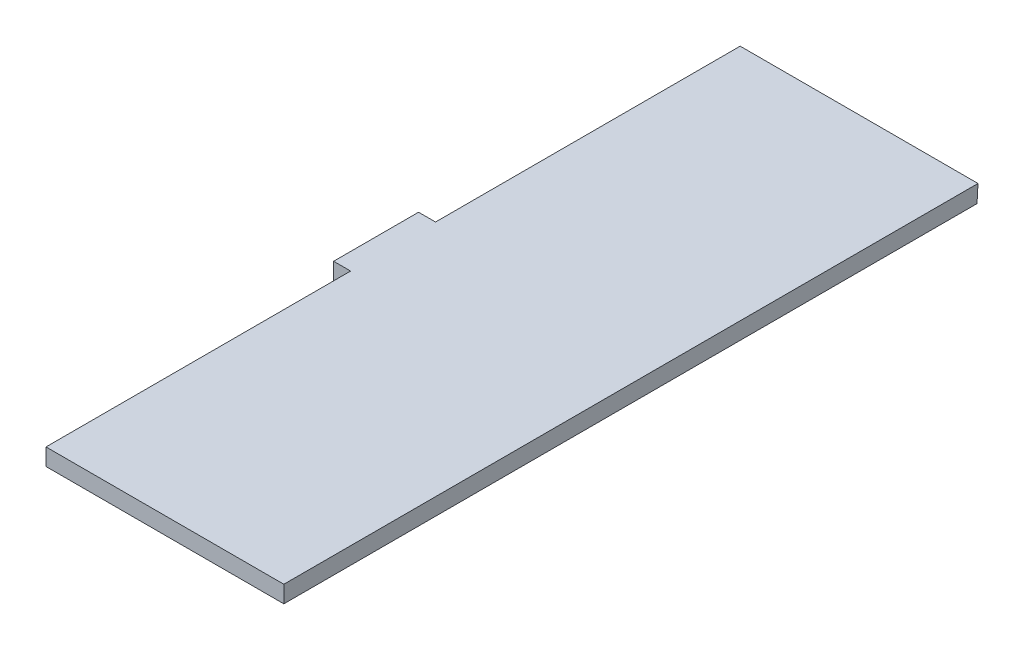
ISO-10303-21;
HEADER;
FILE_DESCRIPTION(('STEP AP214'),'2;1');
FILE_NAME('part.step','',(''),(''),'','','');
FILE_SCHEMA(('AUTOMOTIVE_DESIGN { 1 0 10303 214 1 1 1 1 }'));
ENDSEC;
DATA;
#1=APPLICATION_CONTEXT('core data for automotive mechanical design processes');
#2=APPLICATION_PROTOCOL_DEFINITION('international standard','automotive_design',2000,#1);
#3=PRODUCT_CONTEXT('',#1,'mechanical');
#4=PRODUCT('Part','Part','',(#3));
#5=PRODUCT_RELATED_PRODUCT_CATEGORY('part','',(#4));
#6=PRODUCT_DEFINITION_FORMATION('','',#4);
#7=PRODUCT_DEFINITION_CONTEXT('part definition',#1,'design');
#8=PRODUCT_DEFINITION('design','',#6,#7);
#9=PRODUCT_DEFINITION_SHAPE('','',#8);
#10=(LENGTH_UNIT() NAMED_UNIT(*) SI_UNIT(.MILLI.,.METRE.));
#11=(NAMED_UNIT(*) PLANE_ANGLE_UNIT() SI_UNIT($,.RADIAN.));
#12=(NAMED_UNIT(*) SI_UNIT($,.STERADIAN.) SOLID_ANGLE_UNIT());
#13=UNCERTAINTY_MEASURE_WITH_UNIT(LENGTH_MEASURE(1.E-05),#10,'distance_accuracy_value','');
#14=(GEOMETRIC_REPRESENTATION_CONTEXT(3) GLOBAL_UNCERTAINTY_ASSIGNED_CONTEXT((#13)) GLOBAL_UNIT_ASSIGNED_CONTEXT((#10,
#11,#12)) REPRESENTATION_CONTEXT('',''));
#15=CARTESIAN_POINT('',(0.,0.,0.));
#16=DIRECTION('',(0.,0.,1.));
#17=DIRECTION('',(1.,0.,0.));
#18=AXIS2_PLACEMENT_3D('',#15,#16,#17);
#19=CARTESIAN_POINT('',(-498.,-52.0000000000001,900.));
#20=DIRECTION('',(1.,0.,0.));
#21=DIRECTION('',(0.,0.,-1.));
#22=AXIS2_PLACEMENT_3D('',#19,#20,#21);
#23=PLANE('',#22);
#24=DIRECTION('',(0.,1.,0.));
#25=VECTOR('',#24,1.);
#26=CARTESIAN_POINT('',(-498.,-52.0000000000001,864.139777456175));
#27=LINE('',#26,#25);
#28=CARTESIAN_POINT('',(-498.,-52.0000000000001,864.139777456175));
#29=VERTEX_POINT('',#28);
#30=CARTESIAN_POINT('',(-498.,-50.0000000000001,864.139777456175));
#31=VERTEX_POINT('',#30);
#32=EDGE_CURVE('E138',#29,#31,#27,.T.);
#33=ORIENTED_EDGE('',*,*,#32,.F.);
#34=DIRECTION('',(0.,0.,-1.));
#35=VECTOR('',#34,1.);
#36=CARTESIAN_POINT('',(-498.,-52.0000000000001,900.));
#37=LINE('',#36,#35);
#38=CARTESIAN_POINT('',(-498.,-52.0000000000001,900.));
#39=VERTEX_POINT('',#38);
#40=EDGE_CURVE('E11',#39,#29,#37,.T.);
#41=ORIENTED_EDGE('',*,*,#40,.F.);
#42=DIRECTION('',(0.,-1.,0.));
#43=VECTOR('',#42,1.);
#44=CARTESIAN_POINT('',(-498.,150.,900.));
#45=LINE('',#44,#43);
#46=CARTESIAN_POINT('',(-498.,-50.0000000000001,900.));
#47=VERTEX_POINT('',#46);
#48=EDGE_CURVE('E141',#47,#39,#45,.T.);
#49=ORIENTED_EDGE('',*,*,#48,.F.);
#50=DIRECTION('',(0.,0.,-1.));
#51=VECTOR('',#50,1.);
#52=CARTESIAN_POINT('',(-498.,-50.0000000000001,900.));
#53=LINE('',#52,#51);
#54=EDGE_CURVE('E164',#47,#31,#53,.T.);
#55=ORIENTED_EDGE('',*,*,#54,.T.);
#56=EDGE_LOOP('',(#33,#41,#49,#55));
#57=FACE_BOUND('',#56,.T.);
#58=ADVANCED_FACE('F42',(#57),#23,.F.);
#59=CARTESIAN_POINT('',(-498.,-52.0000000000001,854.139777456175));
#60=VERTEX_POINT('',#59);
#61=CARTESIAN_POINT('',(-498.,-52.0000000000001,818.394251251526));
#62=VERTEX_POINT('',#61);
#63=EDGE_CURVE('E51',#60,#62,#37,.T.);
#64=ORIENTED_EDGE('',*,*,#63,.F.);
#65=DIRECTION('',(0.,1.,0.));
#66=VECTOR('',#65,1.);
#67=CARTESIAN_POINT('',(-498.,-52.0000000000001,854.139777456175));
#68=LINE('',#67,#66);
#69=CARTESIAN_POINT('',(-498.,-50.0000000000001,854.139777456175));
#70=VERTEX_POINT('',#69);
#71=EDGE_CURVE('E128',#60,#70,#68,.T.);
#72=ORIENTED_EDGE('',*,*,#71,.T.);
#73=CARTESIAN_POINT('',(-498.,-50.0000000000001,818.27955491235));
#74=VERTEX_POINT('',#73);
#75=EDGE_CURVE('E167',#70,#74,#53,.T.);
#76=ORIENTED_EDGE('',*,*,#75,.T.);
#77=DIRECTION('',(0.,-0.998359638745858,0.0572540978729116));
#78=VECTOR('',#77,1.);
#79=CARTESIAN_POINT('',(-498.,-56.6645993257805,818.661757484723));
#80=LINE('',#79,#78);
#81=EDGE_CURVE('E46',#74,#62,#80,.T.);
#82=ORIENTED_EDGE('',*,*,#81,.T.);
#83=EDGE_LOOP('',(#64,#72,#76,#82));
#84=FACE_BOUND('',#83,.T.);
#85=ADVANCED_FACE('F44',(#84),#23,.F.);
#86=CARTESIAN_POINT('',(-500.01,-50.0000000000001,818.27955491235));
#87=DIRECTION('',(0.,0.0572540978729116,0.998359638745858));
#88=DIRECTION('',(0.,-0.998359638745858,0.0572540978729116));
#89=AXIS2_PLACEMENT_3D('',#86,#87,#88);
#90=PLANE('',#89);
#91=DIRECTION('',(-1.,0.,0.));
#92=VECTOR('',#91,1.);
#93=CARTESIAN_POINT('',(-498.,-50.0000000000001,818.27955491235));
#94=LINE('',#93,#92);
#95=CARTESIAN_POINT('',(-470.,-50.0000000000001,818.27955491235));
#96=VERTEX_POINT('',#95);
#97=EDGE_CURVE('E147',#96,#74,#94,.T.);
#98=ORIENTED_EDGE('',*,*,#97,.F.);
#99=DIRECTION('',(0.,-0.998359638745858,0.0572540978729116));
#100=VECTOR('',#99,1.);
#101=CARTESIAN_POINT('',(-470.,46.609105446819,812.739199549411));
#102=LINE('',#101,#100);
#103=CARTESIAN_POINT('',(-470.,-52.0000000000001,818.394251251526));
#104=VERTEX_POINT('',#103);
#105=EDGE_CURVE('E144',#96,#104,#102,.T.);
#106=ORIENTED_EDGE('',*,*,#105,.T.);
#107=DIRECTION('',(-1.,0.,0.));
#108=VECTOR('',#107,1.);
#109=CARTESIAN_POINT('',(-470.,-52.0000000000001,818.394251251526));
#110=LINE('',#109,#108);
#111=EDGE_CURVE('E165',#104,#62,#110,.T.);
#112=ORIENTED_EDGE('',*,*,#111,.T.);
#113=ORIENTED_EDGE('',*,*,#81,.F.);
#114=EDGE_LOOP('',(#98,#106,#112,#113));
#115=FACE_BOUND('',#114,.T.);
#116=ADVANCED_FACE('F176',(#115),#90,.F.);
#117=CARTESIAN_POINT('',(-470.,150.,900.));
#118=DIRECTION('',(0.,0.,-1.));
#119=DIRECTION('',(-1.,0.,0.));
#120=AXIS2_PLACEMENT_3D('',#117,#118,#119);
#121=PLANE('',#120);
#122=DIRECTION('',(-1.,0.,0.));
#123=VECTOR('',#122,1.);
#124=CARTESIAN_POINT('',(-498.,-50.0000000000001,900.));
#125=LINE('',#124,#123);
#126=CARTESIAN_POINT('',(-470.,-50.0000000000001,900.));
#127=VERTEX_POINT('',#126);
#128=EDGE_CURVE('E145',#127,#47,#125,.T.);
#129=ORIENTED_EDGE('',*,*,#128,.T.);
#130=ORIENTED_EDGE('',*,*,#48,.T.);
#131=DIRECTION('',(-1.,0.,0.));
#132=VECTOR('',#131,1.);
#133=CARTESIAN_POINT('',(-470.,-52.0000000000001,900.));
#134=LINE('',#133,#132);
#135=CARTESIAN_POINT('',(-470.,-52.0000000000001,900.));
#136=VERTEX_POINT('',#135);
#137=EDGE_CURVE('E152',#136,#39,#134,.T.);
#138=ORIENTED_EDGE('',*,*,#137,.F.);
#139=DIRECTION('',(0.,1.,0.));
#140=VECTOR('',#139,1.);
#141=CARTESIAN_POINT('',(-470.,0.,900.));
#142=LINE('',#141,#140);
#143=EDGE_CURVE('E143',#136,#127,#142,.T.);
#144=ORIENTED_EDGE('',*,*,#143,.T.);
#145=EDGE_LOOP('',(#129,#130,#138,#144));
#146=FACE_BOUND('',#145,.T.);
#147=ADVANCED_FACE('F183',(#146),#121,.F.);
#148=CARTESIAN_POINT('',(-470.,0.,0.));
#149=DIRECTION('',(1.,0.,0.));
#150=DIRECTION('',(0.,0.,-1.));
#151=AXIS2_PLACEMENT_3D('',#148,#149,#150);
#152=PLANE('',#151);
#153=ORIENTED_EDGE('',*,*,#105,.F.);
#154=DIRECTION('',(0.,0.,-1.));
#155=VECTOR('',#154,1.);
#156=CARTESIAN_POINT('',(-470.,-50.0000000000001,900.));
#157=LINE('',#156,#155);
#158=EDGE_CURVE('E153',#127,#96,#157,.T.);
#159=ORIENTED_EDGE('',*,*,#158,.F.);
#160=ORIENTED_EDGE('',*,*,#143,.F.);
#161=DIRECTION('',(0.,0.,-1.));
#162=VECTOR('',#161,1.);
#163=CARTESIAN_POINT('',(-470.,-52.0000000000001,900.));
#164=LINE('',#163,#162);
#165=EDGE_CURVE('E149',#136,#104,#164,.T.);
#166=ORIENTED_EDGE('',*,*,#165,.T.);
#167=EDGE_LOOP('',(#153,#159,#160,#166));
#168=FACE_BOUND('',#167,.T.);
#169=ADVANCED_FACE('F181',(#168),#152,.T.);
#170=CARTESIAN_POINT('',(-470.,-52.0000000000001,900.));
#171=DIRECTION('',(0.,1.,0.));
#172=DIRECTION('',(0.,0.,1.));
#173=AXIS2_PLACEMENT_3D('',#170,#171,#172);
#174=PLANE('',#173);
#175=ORIENTED_EDGE('',*,*,#165,.F.);
#176=ORIENTED_EDGE('',*,*,#137,.T.);
#177=ORIENTED_EDGE('',*,*,#40,.T.);
#178=DIRECTION('',(1.,0.,0.));
#179=VECTOR('',#178,1.);
#180=CARTESIAN_POINT('',(-498.,-52.0000000000001,864.139777456175));
#181=LINE('',#180,#179);
#182=CARTESIAN_POINT('',(-500.,-52.0000000000001,864.139777456175));
#183=VERTEX_POINT('',#182);
#184=EDGE_CURVE('E117',#183,#29,#181,.T.);
#185=ORIENTED_EDGE('',*,*,#184,.F.);
#186=DIRECTION('',(0.,0.,1.));
#187=VECTOR('',#186,1.);
#188=CARTESIAN_POINT('',(-500.,-52.0000000000001,854.139777456175));
#189=LINE('',#188,#187);
#190=CARTESIAN_POINT('',(-500.,-52.0000000000001,854.139777456175));
#191=VERTEX_POINT('',#190);
#192=EDGE_CURVE('E112',#191,#183,#189,.T.);
#193=ORIENTED_EDGE('',*,*,#192,.F.);
#194=DIRECTION('',(-1.,0.,0.));
#195=VECTOR('',#194,1.);
#196=CARTESIAN_POINT('',(-498.,-52.0000000000001,854.139777456175));
#197=LINE('',#196,#195);
#198=EDGE_CURVE('E124',#60,#191,#197,.T.);
#199=ORIENTED_EDGE('',*,*,#198,.F.);
#200=ORIENTED_EDGE('',*,*,#63,.T.);
#201=ORIENTED_EDGE('',*,*,#111,.F.);
#202=EDGE_LOOP('',(#175,#176,#177,#185,#193,#199,#200,#201));
#203=FACE_BOUND('',#202,.T.);
#204=ADVANCED_FACE('F123',(#203),#174,.F.);
#205=CARTESIAN_POINT('',(-498.,-50.0000000000001,900.));
#206=DIRECTION('',(0.,1.,0.));
#207=DIRECTION('',(0.,0.,1.));
#208=AXIS2_PLACEMENT_3D('',#205,#206,#207);
#209=PLANE('',#208);
#210=ORIENTED_EDGE('',*,*,#54,.F.);
#211=ORIENTED_EDGE('',*,*,#128,.F.);
#212=ORIENTED_EDGE('',*,*,#158,.T.);
#213=ORIENTED_EDGE('',*,*,#97,.T.);
#214=ORIENTED_EDGE('',*,*,#75,.F.);
#215=DIRECTION('',(-1.,0.,0.));
#216=VECTOR('',#215,1.);
#217=CARTESIAN_POINT('',(-498.,-50.0000000000001,854.139777456175));
#218=LINE('',#217,#216);
#219=CARTESIAN_POINT('',(-500.,-50.0000000000001,854.139777456175));
#220=VERTEX_POINT('',#219);
#221=EDGE_CURVE('E59',#70,#220,#218,.T.);
#222=ORIENTED_EDGE('',*,*,#221,.T.);
#223=DIRECTION('',(0.,0.,1.));
#224=VECTOR('',#223,1.);
#225=CARTESIAN_POINT('',(-500.,-50.0000000000001,854.139777456175));
#226=LINE('',#225,#224);
#227=CARTESIAN_POINT('',(-500.,-50.0000000000001,864.139777456175));
#228=VERTEX_POINT('',#227);
#229=EDGE_CURVE('E114',#220,#228,#226,.T.);
#230=ORIENTED_EDGE('',*,*,#229,.T.);
#231=DIRECTION('',(1.,0.,0.));
#232=VECTOR('',#231,1.);
#233=CARTESIAN_POINT('',(-498.,-50.0000000000001,864.139777456175));
#234=LINE('',#233,#232);
#235=EDGE_CURVE('E129',#228,#31,#234,.T.);
#236=ORIENTED_EDGE('',*,*,#235,.T.);
#237=EDGE_LOOP('',(#210,#211,#212,#213,#214,#222,#230,#236));
#238=FACE_BOUND('',#237,.T.);
#239=ADVANCED_FACE('F177',(#238),#209,.T.);
#240=CARTESIAN_POINT('',(-498.,-52.0000000000001,854.139777456175));
#241=DIRECTION('',(0.,0.,-1.));
#242=DIRECTION('',(0.,1.,0.));
#243=AXIS2_PLACEMENT_3D('',#240,#241,#242);
#244=PLANE('',#243);
#245=ORIENTED_EDGE('',*,*,#221,.F.);
#246=ORIENTED_EDGE('',*,*,#71,.F.);
#247=ORIENTED_EDGE('',*,*,#198,.T.);
#248=DIRECTION('',(0.,1.,0.));
#249=VECTOR('',#248,1.);
#250=CARTESIAN_POINT('',(-500.,-52.0000000000001,854.139777456175));
#251=LINE('',#250,#249);
#252=EDGE_CURVE('E109',#191,#220,#251,.T.);
#253=ORIENTED_EDGE('',*,*,#252,.T.);
#254=EDGE_LOOP('',(#245,#246,#247,#253));
#255=FACE_BOUND('',#254,.T.);
#256=ADVANCED_FACE('F127',(#255),#244,.T.);
#257=CARTESIAN_POINT('',(-498.,-52.0000000000001,864.139777456175));
#258=DIRECTION('',(0.,0.,1.));
#259=DIRECTION('',(0.,-1.,0.));
#260=AXIS2_PLACEMENT_3D('',#257,#258,#259);
#261=PLANE('',#260);
#262=ORIENTED_EDGE('',*,*,#235,.F.);
#263=DIRECTION('',(0.,1.,0.));
#264=VECTOR('',#263,1.);
#265=CARTESIAN_POINT('',(-500.,-52.0000000000001,864.139777456175));
#266=LINE('',#265,#264);
#267=EDGE_CURVE('E116',#183,#228,#266,.T.);
#268=ORIENTED_EDGE('',*,*,#267,.F.);
#269=ORIENTED_EDGE('',*,*,#184,.T.);
#270=ORIENTED_EDGE('',*,*,#32,.T.);
#271=EDGE_LOOP('',(#262,#268,#269,#270));
#272=FACE_BOUND('',#271,.T.);
#273=ADVANCED_FACE('F208',(#272),#261,.T.);
#274=CARTESIAN_POINT('',(-500.,-52.0000000000001,854.139777456175));
#275=DIRECTION('',(-1.,0.,0.));
#276=DIRECTION('',(0.,0.,1.));
#277=AXIS2_PLACEMENT_3D('',#274,#275,#276);
#278=PLANE('',#277);
#279=ORIENTED_EDGE('',*,*,#229,.F.);
#280=ORIENTED_EDGE('',*,*,#252,.F.);
#281=ORIENTED_EDGE('',*,*,#192,.T.);
#282=ORIENTED_EDGE('',*,*,#267,.T.);
#283=EDGE_LOOP('',(#279,#280,#281,#282));
#284=FACE_BOUND('',#283,.T.);
#285=ADVANCED_FACE('F111',(#284),#278,.T.);
#286=CLOSED_SHELL('',(#58,#85,#116,#147,#169,#204,#239,#256,#273,#285));
#287=MANIFOLD_SOLID_BREP('B2',#286);
#288=ADVANCED_BREP_SHAPE_REPRESENTATION('',(#18,#287),#14);
#289=SHAPE_DEFINITION_REPRESENTATION(#9,#288);
ENDSEC;
END-ISO-10303-21;
